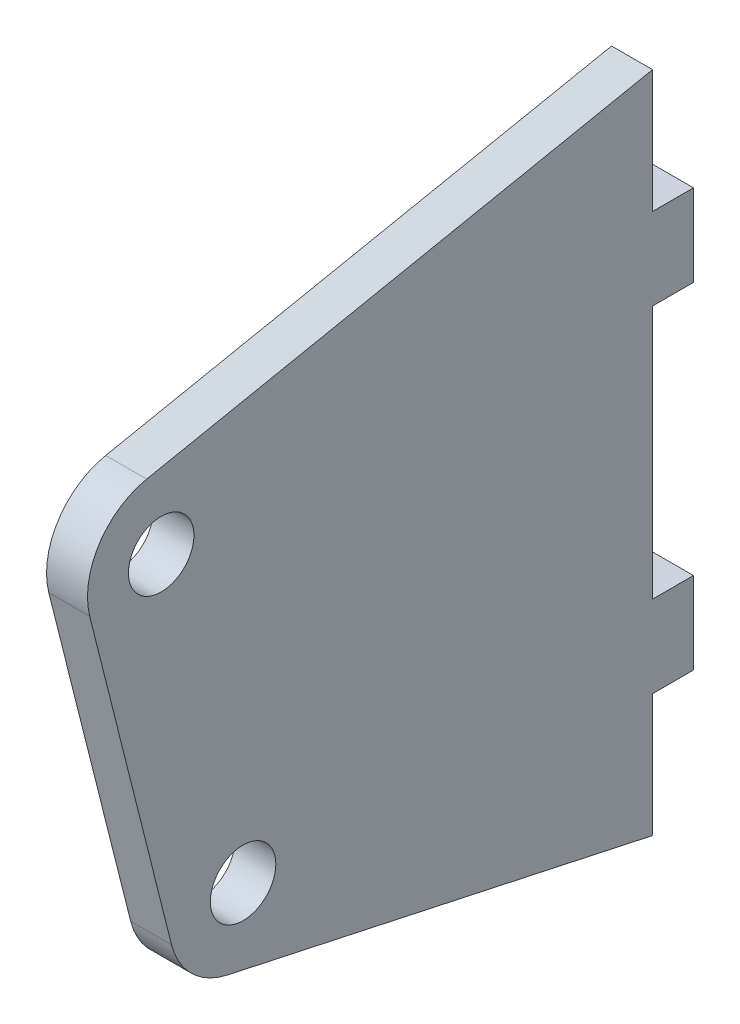
ISO-10303-21;
HEADER;
FILE_DESCRIPTION(('STEP AP214'),'2;1');
FILE_NAME('part.step','',(''),(''),'','','');
FILE_SCHEMA(('AUTOMOTIVE_DESIGN { 1 0 10303 214 1 1 1 1 }'));
ENDSEC;
DATA;
#1=APPLICATION_CONTEXT('core data for automotive mechanical design processes');
#2=APPLICATION_PROTOCOL_DEFINITION('international standard','automotive_design',2000,#1);
#3=PRODUCT_CONTEXT('',#1,'mechanical');
#4=PRODUCT('Part','Part','',(#3));
#5=PRODUCT_RELATED_PRODUCT_CATEGORY('part','',(#4));
#6=PRODUCT_DEFINITION_FORMATION('','',#4);
#7=PRODUCT_DEFINITION_CONTEXT('part definition',#1,'design');
#8=PRODUCT_DEFINITION('design','',#6,#7);
#9=PRODUCT_DEFINITION_SHAPE('','',#8);
#10=(LENGTH_UNIT() NAMED_UNIT(*) SI_UNIT(.MILLI.,.METRE.));
#11=(NAMED_UNIT(*) PLANE_ANGLE_UNIT() SI_UNIT($,.RADIAN.));
#12=(NAMED_UNIT(*) SI_UNIT($,.STERADIAN.) SOLID_ANGLE_UNIT());
#13=UNCERTAINTY_MEASURE_WITH_UNIT(LENGTH_MEASURE(1.E-05),#10,'distance_accuracy_value','');
#14=(GEOMETRIC_REPRESENTATION_CONTEXT(3) GLOBAL_UNCERTAINTY_ASSIGNED_CONTEXT((#13)) GLOBAL_UNIT_ASSIGNED_CONTEXT((#10,
#11,#12)) REPRESENTATION_CONTEXT('',''));
#15=CARTESIAN_POINT('',(0.,0.,0.));
#16=DIRECTION('',(0.,0.,1.));
#17=DIRECTION('',(1.,0.,0.));
#18=AXIS2_PLACEMENT_3D('',#15,#16,#17);
#19=CARTESIAN_POINT('',(2.5,-20.5,50.));
#20=DIRECTION('',(-1.,0.,0.));
#21=DIRECTION('',(0.,0.,1.));
#22=AXIS2_PLACEMENT_3D('',#19,#20,#21);
#23=CYLINDRICAL_SURFACE('',#22,9.00000000000001);
#24=CARTESIAN_POINT('',(-2.5,-20.5,50.));
#25=DIRECTION('',(1.,0.,0.));
#26=DIRECTION('',(0.,0.,-1.));
#27=AXIS2_PLACEMENT_3D('',#24,#25,#26);
#28=CIRCLE('',#27,9.00000000000001);
#29=CARTESIAN_POINT('',(-2.5,-29.2973845222155,51.8989538088862));
#30=VERTEX_POINT('',#29);
#31=CARTESIAN_POINT('',(-2.5,-22.6951219512195,58.7281979594458));
#32=VERTEX_POINT('',#31);
#33=EDGE_CURVE('E177',#30,#32,#28,.F.);
#34=ORIENTED_EDGE('',*,*,#33,.F.);
#35=DIRECTION('',(-1.,0.,0.));
#36=VECTOR('',#35,1.);
#37=CARTESIAN_POINT('',(2.5,-29.2973845222155,51.8989538088862));
#38=LINE('',#37,#36);
#39=CARTESIAN_POINT('',(2.5,-29.2973845222155,51.8989538088862));
#40=VERTEX_POINT('',#39);
#41=EDGE_CURVE('E11',#40,#30,#38,.T.);
#42=ORIENTED_EDGE('',*,*,#41,.F.);
#43=CARTESIAN_POINT('',(2.5,-20.5,50.));
#44=DIRECTION('',(1.,0.,0.));
#45=DIRECTION('',(0.,0.,-1.));
#46=AXIS2_PLACEMENT_3D('',#43,#44,#45);
#47=CIRCLE('',#46,9.00000000000001);
#48=CARTESIAN_POINT('',(2.5,-22.6951219512195,58.7281979594458));
#49=VERTEX_POINT('',#48);
#50=EDGE_CURVE('E215',#40,#49,#47,.F.);
#51=ORIENTED_EDGE('',*,*,#50,.T.);
#52=DIRECTION('',(-1.,0.,0.));
#53=VECTOR('',#52,1.);
#54=CARTESIAN_POINT('',(2.5,-22.6951219512195,58.7281979594458));
#55=LINE('',#54,#53);
#56=EDGE_CURVE('E57',#49,#32,#55,.T.);
#57=ORIENTED_EDGE('',*,*,#56,.T.);
#58=EDGE_LOOP('',(#34,#42,#51,#57));
#59=FACE_BOUND('',#58,.T.);
#60=ADVANCED_FACE('F41',(#59),#23,.T.);
#61=CARTESIAN_POINT('',(2.5,-38.6969872158583,8.35291342334877));
#62=DIRECTION('',(0.,-0.977487169135054,0.210994867654021));
#63=DIRECTION('',(0.,-0.210994867654021,-0.977487169135054));
#64=AXIS2_PLACEMENT_3D('',#61,#62,#63);
#65=PLANE('',#64);
#66=DIRECTION('',(0.,0.210994867654021,0.977487169135054));
#67=VECTOR('',#66,1.);
#68=CARTESIAN_POINT('',(-2.5,-38.6969872158583,8.35291342334877));
#69=LINE('',#68,#67);
#70=CARTESIAN_POINT('',(-2.5,-40.5,0.));
#71=VERTEX_POINT('',#70);
#72=EDGE_CURVE('E179',#71,#30,#69,.T.);
#73=ORIENTED_EDGE('',*,*,#72,.F.);
#74=DIRECTION('',(-1.,0.,0.));
#75=VECTOR('',#74,1.);
#76=CARTESIAN_POINT('',(2.5,-40.5,0.));
#77=LINE('',#76,#75);
#78=CARTESIAN_POINT('',(2.5,-40.5,0.));
#79=VERTEX_POINT('',#78);
#80=EDGE_CURVE('E49',#79,#71,#77,.T.);
#81=ORIENTED_EDGE('',*,*,#80,.F.);
#82=DIRECTION('',(0.,0.210994867654021,0.977487169135054));
#83=VECTOR('',#82,1.);
#84=CARTESIAN_POINT('',(2.5,-38.6969872158583,8.35291342334877));
#85=LINE('',#84,#83);
#86=EDGE_CURVE('E251',#79,#40,#85,.T.);
#87=ORIENTED_EDGE('',*,*,#86,.T.);
#88=ORIENTED_EDGE('',*,*,#41,.T.);
#89=EDGE_LOOP('',(#73,#81,#87,#88));
#90=FACE_BOUND('',#89,.T.);
#91=ADVANCED_FACE('F250',(#90),#65,.T.);
#92=CARTESIAN_POINT('',(2.5,0.,0.));
#93=DIRECTION('',(0.,0.,1.));
#94=DIRECTION('',(1.,0.,0.));
#95=AXIS2_PLACEMENT_3D('',#92,#93,#94);
#96=PLANE('',#95);
#97=DIRECTION('',(0.,1.,0.));
#98=VECTOR('',#97,1.);
#99=CARTESIAN_POINT('',(-2.5,0.,0.));
#100=LINE('',#99,#98);
#101=CARTESIAN_POINT('',(-2.5,-25.5,0.));
#102=VERTEX_POINT('',#101);
#103=EDGE_CURVE('E182',#71,#102,#100,.T.);
#104=ORIENTED_EDGE('',*,*,#103,.T.);
#105=DIRECTION('',(-1.,0.,0.));
#106=VECTOR('',#105,1.);
#107=CARTESIAN_POINT('',(2.5,-25.5,0.));
#108=LINE('',#107,#106);
#109=CARTESIAN_POINT('',(2.5,-25.5,0.));
#110=VERTEX_POINT('',#109);
#111=EDGE_CURVE('E235',#110,#102,#108,.T.);
#112=ORIENTED_EDGE('',*,*,#111,.F.);
#113=DIRECTION('',(0.,1.,0.));
#114=VECTOR('',#113,1.);
#115=CARTESIAN_POINT('',(2.5,0.,0.));
#116=LINE('',#115,#114);
#117=EDGE_CURVE('E241',#79,#110,#116,.T.);
#118=ORIENTED_EDGE('',*,*,#117,.F.);
#119=ORIENTED_EDGE('',*,*,#80,.T.);
#120=EDGE_LOOP('',(#104,#112,#118,#119));
#121=FACE_BOUND('',#120,.T.);
#122=ADVANCED_FACE('F239',(#121),#96,.F.);
#123=CARTESIAN_POINT('',(2.5,-25.5,0.));
#124=DIRECTION('',(0.,-1.,0.));
#125=DIRECTION('',(0.,0.,-1.));
#126=AXIS2_PLACEMENT_3D('',#123,#124,#125);
#127=PLANE('',#126);
#128=DIRECTION('',(0.,0.,1.));
#129=VECTOR('',#128,1.);
#130=CARTESIAN_POINT('',(-2.5,-25.5,0.));
#131=LINE('',#130,#129);
#132=CARTESIAN_POINT('',(-2.5,-25.5,-5.));
#133=VERTEX_POINT('',#132);
#134=EDGE_CURVE('E185',#133,#102,#131,.T.);
#135=ORIENTED_EDGE('',*,*,#134,.F.);
#136=DIRECTION('',(-1.,0.,0.));
#137=VECTOR('',#136,1.);
#138=CARTESIAN_POINT('',(2.5,-25.5,-5.));
#139=LINE('',#138,#137);
#140=CARTESIAN_POINT('',(2.5,-25.5,-5.));
#141=VERTEX_POINT('',#140);
#142=EDGE_CURVE('E233',#141,#133,#139,.T.);
#143=ORIENTED_EDGE('',*,*,#142,.F.);
#144=DIRECTION('',(0.,0.,1.));
#145=VECTOR('',#144,1.);
#146=CARTESIAN_POINT('',(2.5,-25.5,0.));
#147=LINE('',#146,#145);
#148=EDGE_CURVE('E452',#141,#110,#147,.T.);
#149=ORIENTED_EDGE('',*,*,#148,.T.);
#150=ORIENTED_EDGE('',*,*,#111,.T.);
#151=EDGE_LOOP('',(#135,#143,#149,#150));
#152=FACE_BOUND('',#151,.T.);
#153=ADVANCED_FACE('F273',(#152),#127,.T.);
#154=CARTESIAN_POINT('',(2.5,0.,-4.99999999999999));
#155=DIRECTION('',(0.,0.,-1.));
#156=DIRECTION('',(0.,1.,0.));
#157=AXIS2_PLACEMENT_3D('',#154,#155,#156);
#158=PLANE('',#157);
#159=DIRECTION('',(0.,-1.,0.));
#160=VECTOR('',#159,1.);
#161=CARTESIAN_POINT('',(-2.5,0.,-4.99999999999999));
#162=LINE('',#161,#160);
#163=CARTESIAN_POINT('',(-2.5,-15.5,-5.));
#164=VERTEX_POINT('',#163);
#165=EDGE_CURVE('E190',#164,#133,#162,.T.);
#166=ORIENTED_EDGE('',*,*,#165,.F.);
#167=DIRECTION('',(-1.,0.,0.));
#168=VECTOR('',#167,1.);
#169=CARTESIAN_POINT('',(2.5,-15.5,-5.));
#170=LINE('',#169,#168);
#171=CARTESIAN_POINT('',(2.5,-15.5,-5.));
#172=VERTEX_POINT('',#171);
#173=EDGE_CURVE('E231',#172,#164,#170,.T.);
#174=ORIENTED_EDGE('',*,*,#173,.F.);
#175=DIRECTION('',(0.,-1.,0.));
#176=VECTOR('',#175,1.);
#177=CARTESIAN_POINT('',(2.5,0.,-4.99999999999999));
#178=LINE('',#177,#176);
#179=EDGE_CURVE('E455',#172,#141,#178,.T.);
#180=ORIENTED_EDGE('',*,*,#179,.T.);
#181=ORIENTED_EDGE('',*,*,#142,.T.);
#182=EDGE_LOOP('',(#166,#174,#180,#181));
#183=FACE_BOUND('',#182,.T.);
#184=ADVANCED_FACE('F280',(#183),#158,.T.);
#185=CARTESIAN_POINT('',(2.5,-15.5,0.));
#186=DIRECTION('',(0.,-1.,0.));
#187=DIRECTION('',(0.,0.,-1.));
#188=AXIS2_PLACEMENT_3D('',#185,#186,#187);
#189=PLANE('',#188);
#190=DIRECTION('',(0.,0.,1.));
#191=VECTOR('',#190,1.);
#192=CARTESIAN_POINT('',(-2.5,-15.5,0.));
#193=LINE('',#192,#191);
#194=CARTESIAN_POINT('',(-2.5,-15.5,0.));
#195=VERTEX_POINT('',#194);
#196=EDGE_CURVE('E193',#164,#195,#193,.T.);
#197=ORIENTED_EDGE('',*,*,#196,.T.);
#198=DIRECTION('',(-1.,0.,0.));
#199=VECTOR('',#198,1.);
#200=CARTESIAN_POINT('',(2.5,-15.5,0.));
#201=LINE('',#200,#199);
#202=CARTESIAN_POINT('',(2.5,-15.5,0.));
#203=VERTEX_POINT('',#202);
#204=EDGE_CURVE('E228',#203,#195,#201,.T.);
#205=ORIENTED_EDGE('',*,*,#204,.F.);
#206=DIRECTION('',(0.,0.,1.));
#207=VECTOR('',#206,1.);
#208=CARTESIAN_POINT('',(2.5,-15.5,0.));
#209=LINE('',#208,#207);
#210=EDGE_CURVE('E444',#172,#203,#209,.T.);
#211=ORIENTED_EDGE('',*,*,#210,.F.);
#212=ORIENTED_EDGE('',*,*,#173,.T.);
#213=EDGE_LOOP('',(#197,#205,#211,#212));
#214=FACE_BOUND('',#213,.T.);
#215=ADVANCED_FACE('F284',(#214),#189,.F.);
#216=CARTESIAN_POINT('',(-2.5,15.5,0.));
#217=VERTEX_POINT('',#216);
#218=EDGE_CURVE('E187',#195,#217,#100,.T.);
#219=ORIENTED_EDGE('',*,*,#218,.T.);
#220=DIRECTION('',(-1.,0.,0.));
#221=VECTOR('',#220,1.);
#222=CARTESIAN_POINT('',(2.5,15.5,0.));
#223=LINE('',#222,#221);
#224=CARTESIAN_POINT('',(2.5,15.5,0.));
#225=VERTEX_POINT('',#224);
#226=EDGE_CURVE('E226',#225,#217,#223,.T.);
#227=ORIENTED_EDGE('',*,*,#226,.F.);
#228=EDGE_CURVE('E440',#203,#225,#116,.T.);
#229=ORIENTED_EDGE('',*,*,#228,.F.);
#230=ORIENTED_EDGE('',*,*,#204,.T.);
#231=EDGE_LOOP('',(#219,#227,#229,#230));
#232=FACE_BOUND('',#231,.T.);
#233=ADVANCED_FACE('F275',(#232),#96,.F.);
#234=CARTESIAN_POINT('',(2.5,15.5,0.));
#235=DIRECTION('',(0.,-1.,0.));
#236=DIRECTION('',(0.,0.,-1.));
#237=AXIS2_PLACEMENT_3D('',#234,#235,#236);
#238=PLANE('',#237);
#239=DIRECTION('',(0.,0.,1.));
#240=VECTOR('',#239,1.);
#241=CARTESIAN_POINT('',(-2.5,15.5,0.));
#242=LINE('',#241,#240);
#243=CARTESIAN_POINT('',(-2.5,15.5,-4.99999999999999));
#244=VERTEX_POINT('',#243);
#245=EDGE_CURVE('E195',#244,#217,#242,.T.);
#246=ORIENTED_EDGE('',*,*,#245,.F.);
#247=DIRECTION('',(-1.,0.,0.));
#248=VECTOR('',#247,1.);
#249=CARTESIAN_POINT('',(2.5,15.5,-4.99999999999999));
#250=LINE('',#249,#248);
#251=CARTESIAN_POINT('',(2.5,15.5,-4.99999999999999));
#252=VERTEX_POINT('',#251);
#253=EDGE_CURVE('E224',#252,#244,#250,.T.);
#254=ORIENTED_EDGE('',*,*,#253,.F.);
#255=DIRECTION('',(0.,0.,1.));
#256=VECTOR('',#255,1.);
#257=CARTESIAN_POINT('',(2.5,15.5,0.));
#258=LINE('',#257,#256);
#259=EDGE_CURVE('E436',#252,#225,#258,.T.);
#260=ORIENTED_EDGE('',*,*,#259,.T.);
#261=ORIENTED_EDGE('',*,*,#226,.T.);
#262=EDGE_LOOP('',(#246,#254,#260,#261));
#263=FACE_BOUND('',#262,.T.);
#264=ADVANCED_FACE('F289',(#263),#238,.T.);
#265=CARTESIAN_POINT('',(2.5,0.,-4.99999999999997));
#266=DIRECTION('',(0.,0.,-1.));
#267=DIRECTION('',(0.,1.,0.));
#268=AXIS2_PLACEMENT_3D('',#265,#266,#267);
#269=PLANE('',#268);
#270=DIRECTION('',(0.,-1.,0.));
#271=VECTOR('',#270,1.);
#272=CARTESIAN_POINT('',(-2.5,0.,-4.99999999999997));
#273=LINE('',#272,#271);
#274=CARTESIAN_POINT('',(-2.5,25.5,-5.00000000000001));
#275=VERTEX_POINT('',#274);
#276=EDGE_CURVE('E198',#275,#244,#273,.T.);
#277=ORIENTED_EDGE('',*,*,#276,.F.);
#278=DIRECTION('',(-1.,0.,0.));
#279=VECTOR('',#278,1.);
#280=CARTESIAN_POINT('',(2.5,25.5,-5.00000000000001));
#281=LINE('',#280,#279);
#282=CARTESIAN_POINT('',(2.5,25.5,-5.00000000000001));
#283=VERTEX_POINT('',#282);
#284=EDGE_CURVE('E222',#283,#275,#281,.T.);
#285=ORIENTED_EDGE('',*,*,#284,.F.);
#286=DIRECTION('',(0.,-1.,0.));
#287=VECTOR('',#286,1.);
#288=CARTESIAN_POINT('',(2.5,0.,-4.99999999999997));
#289=LINE('',#288,#287);
#290=EDGE_CURVE('E439',#283,#252,#289,.T.);
#291=ORIENTED_EDGE('',*,*,#290,.T.);
#292=ORIENTED_EDGE('',*,*,#253,.T.);
#293=EDGE_LOOP('',(#277,#285,#291,#292));
#294=FACE_BOUND('',#293,.T.);
#295=ADVANCED_FACE('F292',(#294),#269,.T.);
#296=CARTESIAN_POINT('',(2.5,25.5,0.));
#297=DIRECTION('',(0.,-1.,0.));
#298=DIRECTION('',(0.,0.,-1.));
#299=AXIS2_PLACEMENT_3D('',#296,#297,#298);
#300=PLANE('',#299);
#301=DIRECTION('',(0.,0.,1.));
#302=VECTOR('',#301,1.);
#303=CARTESIAN_POINT('',(-2.5,25.5,0.));
#304=LINE('',#303,#302);
#305=CARTESIAN_POINT('',(-2.5,25.5,0.));
#306=VERTEX_POINT('',#305);
#307=EDGE_CURVE('E201',#275,#306,#304,.T.);
#308=ORIENTED_EDGE('',*,*,#307,.T.);
#309=DIRECTION('',(-1.,0.,0.));
#310=VECTOR('',#309,1.);
#311=CARTESIAN_POINT('',(2.5,25.5,0.));
#312=LINE('',#311,#310);
#313=CARTESIAN_POINT('',(2.5,25.5,0.));
#314=VERTEX_POINT('',#313);
#315=EDGE_CURVE('E219',#314,#306,#312,.T.);
#316=ORIENTED_EDGE('',*,*,#315,.F.);
#317=DIRECTION('',(0.,0.,1.));
#318=VECTOR('',#317,1.);
#319=CARTESIAN_POINT('',(2.5,25.5,0.));
#320=LINE('',#319,#318);
#321=EDGE_CURVE('E442',#283,#314,#320,.T.);
#322=ORIENTED_EDGE('',*,*,#321,.F.);
#323=ORIENTED_EDGE('',*,*,#284,.T.);
#324=EDGE_LOOP('',(#308,#316,#322,#323));
#325=FACE_BOUND('',#324,.T.);
#326=ADVANCED_FACE('F296',(#325),#300,.F.);
#327=CARTESIAN_POINT('',(-2.5,40.5,0.));
#328=VERTEX_POINT('',#327);
#329=EDGE_CURVE('E186',#306,#328,#100,.T.);
#330=ORIENTED_EDGE('',*,*,#329,.T.);
#331=DIRECTION('',(-1.,0.,0.));
#332=VECTOR('',#331,1.);
#333=CARTESIAN_POINT('',(2.5,40.5,0.));
#334=LINE('',#333,#332);
#335=CARTESIAN_POINT('',(2.5,40.5,0.));
#336=VERTEX_POINT('',#335);
#337=EDGE_CURVE('E163',#336,#328,#334,.T.);
#338=ORIENTED_EDGE('',*,*,#337,.F.);
#339=EDGE_CURVE('E151',#314,#336,#116,.T.);
#340=ORIENTED_EDGE('',*,*,#339,.F.);
#341=ORIENTED_EDGE('',*,*,#315,.T.);
#342=EDGE_LOOP('',(#330,#338,#340,#341));
#343=FACE_BOUND('',#342,.T.);
#344=ADVANCED_FACE('F276',(#343),#96,.F.);
#345=CARTESIAN_POINT('',(2.5,38.927735287379,7.82334356490855));
#346=DIRECTION('',(0.,-0.98039718944471,-0.197031345041627));
#347=DIRECTION('',(0.,0.197031345041627,-0.98039718944471));
#348=AXIS2_PLACEMENT_3D('',#345,#346,#347);
#349=PLANE('',#348);
#350=DIRECTION('',(0.,-0.197031345041627,0.980397189444711));
#351=VECTOR('',#350,1.);
#352=CARTESIAN_POINT('',(-2.5,38.927735287379,7.82334356490855));
#353=LINE('',#352,#351);
#354=CARTESIAN_POINT('',(-2.5,28.0853654091445,61.7732821053747));
#355=VERTEX_POINT('',#354);
#356=EDGE_CURVE('E160',#328,#355,#353,.T.);
#357=ORIENTED_EDGE('',*,*,#356,.T.);
#358=DIRECTION('',(-1.,0.,0.));
#359=VECTOR('',#358,1.);
#360=CARTESIAN_POINT('',(2.5,28.0853654091445,61.7732821053747));
#361=LINE('',#360,#359);
#362=CARTESIAN_POINT('',(2.5,28.0853654091445,61.7732821053747));
#363=VERTEX_POINT('',#362);
#364=EDGE_CURVE('E157',#363,#355,#361,.T.);
#365=ORIENTED_EDGE('',*,*,#364,.F.);
#366=DIRECTION('',(0.,-0.197031345041627,0.980397189444711));
#367=VECTOR('',#366,1.);
#368=CARTESIAN_POINT('',(2.5,38.927735287379,7.82334356490855));
#369=LINE('',#368,#367);
#370=EDGE_CURVE('E143',#336,#363,#369,.T.);
#371=ORIENTED_EDGE('',*,*,#370,.F.);
#372=ORIENTED_EDGE('',*,*,#337,.T.);
#373=EDGE_LOOP('',(#357,#365,#371,#372));
#374=FACE_BOUND('',#373,.T.);
#375=ADVANCED_FACE('F158',(#374),#349,.F.);
#376=CARTESIAN_POINT('',(2.5,19.2617907041421,60.));
#377=DIRECTION('',(-1.,0.,0.));
#378=DIRECTION('',(0.,0.,1.));
#379=AXIS2_PLACEMENT_3D('',#376,#377,#378);
#380=CYLINDRICAL_SURFACE('',#379,9.);
#381=CARTESIAN_POINT('',(-2.5,19.2617907041421,60.));
#382=DIRECTION('',(1.,0.,0.));
#383=DIRECTION('',(0.,0.,-1.));
#384=AXIS2_PLACEMENT_3D('',#381,#382,#383);
#385=CIRCLE('',#384,9.);
#386=CARTESIAN_POINT('',(-2.5,17.0666687529226,68.7281979594458));
#387=VERTEX_POINT('',#386);
#388=EDGE_CURVE('E204',#355,#387,#385,.T.);
#389=ORIENTED_EDGE('',*,*,#388,.T.);
#390=DIRECTION('',(-1.,0.,0.));
#391=VECTOR('',#390,1.);
#392=CARTESIAN_POINT('',(2.5,17.0666687529226,68.7281979594458));
#393=LINE('',#392,#391);
#394=CARTESIAN_POINT('',(2.5,17.0666687529226,68.7281979594458));
#395=VERTEX_POINT('',#394);
#396=EDGE_CURVE('E101',#395,#387,#393,.T.);
#397=ORIENTED_EDGE('',*,*,#396,.F.);
#398=CARTESIAN_POINT('',(2.5,19.2617907041421,60.));
#399=DIRECTION('',(1.,0.,0.));
#400=DIRECTION('',(0.,0.,-1.));
#401=AXIS2_PLACEMENT_3D('',#398,#399,#400);
#402=CIRCLE('',#401,9.);
#403=EDGE_CURVE('E149',#363,#395,#402,.T.);
#404=ORIENTED_EDGE('',*,*,#403,.F.);
#405=ORIENTED_EDGE('',*,*,#364,.T.);
#406=EDGE_LOOP('',(#389,#397,#404,#405));
#407=FACE_BOUND('',#406,.T.);
#408=ADVANCED_FACE('F165',(#407),#380,.T.);
#409=CARTESIAN_POINT('',(2.5,19.2617907041421,60.));
#410=DIRECTION('',(-1.,0.,0.));
#411=DIRECTION('',(0.,0.,1.));
#412=AXIS2_PLACEMENT_3D('',#409,#410,#411);
#413=CYLINDRICAL_SURFACE('',#412,4.);
#414=CARTESIAN_POINT('',(2.5,19.2617907041421,60.));
#415=DIRECTION('',(1.,0.,0.));
#416=DIRECTION('',(0.,0.,-1.));
#417=AXIS2_PLACEMENT_3D('',#414,#415,#416);
#418=CIRCLE('',#417,4.);
#419=CARTESIAN_POINT('',(2.5,19.2617907041421,56.));
#420=VERTEX_POINT('',#419);
#421=EDGE_CURVE('E168',#420,#420,#418,.T.);
#422=ORIENTED_EDGE('',*,*,#421,.T.);
#423=EDGE_LOOP('',(#422));
#424=FACE_BOUND('',#423,.T.);
#425=CARTESIAN_POINT('',(-2.5,19.2617907041421,60.));
#426=DIRECTION('',(1.,0.,0.));
#427=DIRECTION('',(0.,0.,-1.));
#428=AXIS2_PLACEMENT_3D('',#425,#426,#427);
#429=CIRCLE('',#428,4.);
#430=CARTESIAN_POINT('',(-2.5,19.2617907041421,56.));
#431=VERTEX_POINT('',#430);
#432=EDGE_CURVE('E209',#431,#431,#429,.T.);
#433=ORIENTED_EDGE('',*,*,#432,.F.);
#434=EDGE_LOOP('',(#433));
#435=FACE_BOUND('',#434,.T.);
#436=ADVANCED_FACE('F255',(#424,#435),#413,.F.);
#437=CARTESIAN_POINT('',(2.5,-15.2414606496556,60.6027768377023));
#438=DIRECTION('',(0.,-0.24390243902439,0.969799773271758));
#439=DIRECTION('',(0.,-0.969799773271758,-0.243902439024391));
#440=AXIS2_PLACEMENT_3D('',#437,#438,#439);
#441=PLANE('',#440);
#442=DIRECTION('',(0.,0.969799773271758,0.24390243902439));
#443=VECTOR('',#442,1.);
#444=CARTESIAN_POINT('',(-2.5,-15.2414606496556,60.6027768377023));
#445=LINE('',#444,#443);
#446=EDGE_CURVE('E206',#32,#387,#445,.T.);
#447=ORIENTED_EDGE('',*,*,#446,.F.);
#448=ORIENTED_EDGE('',*,*,#56,.F.);
#449=DIRECTION('',(0.,0.969799773271758,0.24390243902439));
#450=VECTOR('',#449,1.);
#451=CARTESIAN_POINT('',(2.5,-15.2414606496556,60.6027768377023));
#452=LINE('',#451,#450);
#453=EDGE_CURVE('E166',#49,#395,#452,.T.);
#454=ORIENTED_EDGE('',*,*,#453,.T.);
#455=ORIENTED_EDGE('',*,*,#396,.T.);
#456=EDGE_LOOP('',(#447,#448,#454,#455));
#457=FACE_BOUND('',#456,.T.);
#458=ADVANCED_FACE('F252',(#457),#441,.T.);
#459=CARTESIAN_POINT('',(2.5,-20.5,50.));
#460=DIRECTION('',(-1.,0.,0.));
#461=DIRECTION('',(0.,0.,1.));
#462=AXIS2_PLACEMENT_3D('',#459,#460,#461);
#463=CYLINDRICAL_SURFACE('',#462,4.);
#464=CARTESIAN_POINT('',(2.5,-20.5,50.));
#465=DIRECTION('',(1.,0.,0.));
#466=DIRECTION('',(0.,0.,-1.));
#467=AXIS2_PLACEMENT_3D('',#464,#465,#466);
#468=CIRCLE('',#467,4.);
#469=CARTESIAN_POINT('',(2.5,-20.5,46.));
#470=VERTEX_POINT('',#469);
#471=EDGE_CURVE('E174',#470,#470,#468,.T.);
#472=ORIENTED_EDGE('',*,*,#471,.T.);
#473=EDGE_LOOP('',(#472));
#474=FACE_BOUND('',#473,.T.);
#475=CARTESIAN_POINT('',(-2.5,-20.5,50.));
#476=DIRECTION('',(1.,0.,0.));
#477=DIRECTION('',(0.,0.,-1.));
#478=AXIS2_PLACEMENT_3D('',#475,#476,#477);
#479=CIRCLE('',#478,4.);
#480=CARTESIAN_POINT('',(-2.5,-20.5,46.));
#481=VERTEX_POINT('',#480);
#482=EDGE_CURVE('E212',#481,#481,#479,.T.);
#483=ORIENTED_EDGE('',*,*,#482,.F.);
#484=EDGE_LOOP('',(#483));
#485=FACE_BOUND('',#484,.T.);
#486=ADVANCED_FACE('F254',(#474,#485),#463,.F.);
#487=CARTESIAN_POINT('',(2.5,0.,0.));
#488=DIRECTION('',(1.,0.,0.));
#489=DIRECTION('',(0.,0.,-1.));
#490=AXIS2_PLACEMENT_3D('',#487,#488,#489);
#491=PLANE('',#490);
#492=ORIENTED_EDGE('',*,*,#50,.F.);
#493=ORIENTED_EDGE('',*,*,#86,.F.);
#494=ORIENTED_EDGE('',*,*,#117,.T.);
#495=ORIENTED_EDGE('',*,*,#148,.F.);
#496=ORIENTED_EDGE('',*,*,#179,.F.);
#497=ORIENTED_EDGE('',*,*,#210,.T.);
#498=ORIENTED_EDGE('',*,*,#228,.T.);
#499=ORIENTED_EDGE('',*,*,#259,.F.);
#500=ORIENTED_EDGE('',*,*,#290,.F.);
#501=ORIENTED_EDGE('',*,*,#321,.T.);
#502=ORIENTED_EDGE('',*,*,#339,.T.);
#503=ORIENTED_EDGE('',*,*,#370,.T.);
#504=ORIENTED_EDGE('',*,*,#403,.T.);
#505=ORIENTED_EDGE('',*,*,#453,.F.);
#506=EDGE_LOOP('',(#492,#493,#494,#495,#496,#497,#498,#499,#500,#501,#502,#503,#504,#505));
#507=FACE_BOUND('',#506,.T.);
#508=ORIENTED_EDGE('',*,*,#421,.F.);
#509=EDGE_LOOP('',(#508));
#510=FACE_BOUND('',#509,.T.);
#511=ORIENTED_EDGE('',*,*,#471,.F.);
#512=EDGE_LOOP('',(#511));
#513=FACE_BOUND('',#512,.T.);
#514=ADVANCED_FACE('F145',(#507,#510,#513),#491,.T.);
#515=CARTESIAN_POINT('',(-2.5,0.,0.));
#516=DIRECTION('',(1.,0.,0.));
#517=DIRECTION('',(0.,0.,-1.));
#518=AXIS2_PLACEMENT_3D('',#515,#516,#517);
#519=PLANE('',#518);
#520=ORIENTED_EDGE('',*,*,#33,.T.);
#521=ORIENTED_EDGE('',*,*,#446,.T.);
#522=ORIENTED_EDGE('',*,*,#388,.F.);
#523=ORIENTED_EDGE('',*,*,#356,.F.);
#524=ORIENTED_EDGE('',*,*,#329,.F.);
#525=ORIENTED_EDGE('',*,*,#307,.F.);
#526=ORIENTED_EDGE('',*,*,#276,.T.);
#527=ORIENTED_EDGE('',*,*,#245,.T.);
#528=ORIENTED_EDGE('',*,*,#218,.F.);
#529=ORIENTED_EDGE('',*,*,#196,.F.);
#530=ORIENTED_EDGE('',*,*,#165,.T.);
#531=ORIENTED_EDGE('',*,*,#134,.T.);
#532=ORIENTED_EDGE('',*,*,#103,.F.);
#533=ORIENTED_EDGE('',*,*,#72,.T.);
#534=EDGE_LOOP('',(#520,#521,#522,#523,#524,#525,#526,#527,#528,#529,#530,#531,#532,#533));
#535=FACE_BOUND('',#534,.T.);
#536=ORIENTED_EDGE('',*,*,#432,.T.);
#537=EDGE_LOOP('',(#536));
#538=FACE_BOUND('',#537,.T.);
#539=ORIENTED_EDGE('',*,*,#482,.T.);
#540=EDGE_LOOP('',(#539));
#541=FACE_BOUND('',#540,.T.);
#542=ADVANCED_FACE('F247',(#535,#538,#541),#519,.F.);
#543=CLOSED_SHELL('',(#60,#91,#122,#153,#184,#215,#233,#264,#295,#326,#344,#375,#408,#436,#458,
#486,#514,#542));
#544=MANIFOLD_SOLID_BREP('B2',#543);
#545=ADVANCED_BREP_SHAPE_REPRESENTATION('',(#18,#544),#14);
#546=SHAPE_DEFINITION_REPRESENTATION(#9,#545);
ENDSEC;
END-ISO-10303-21;
